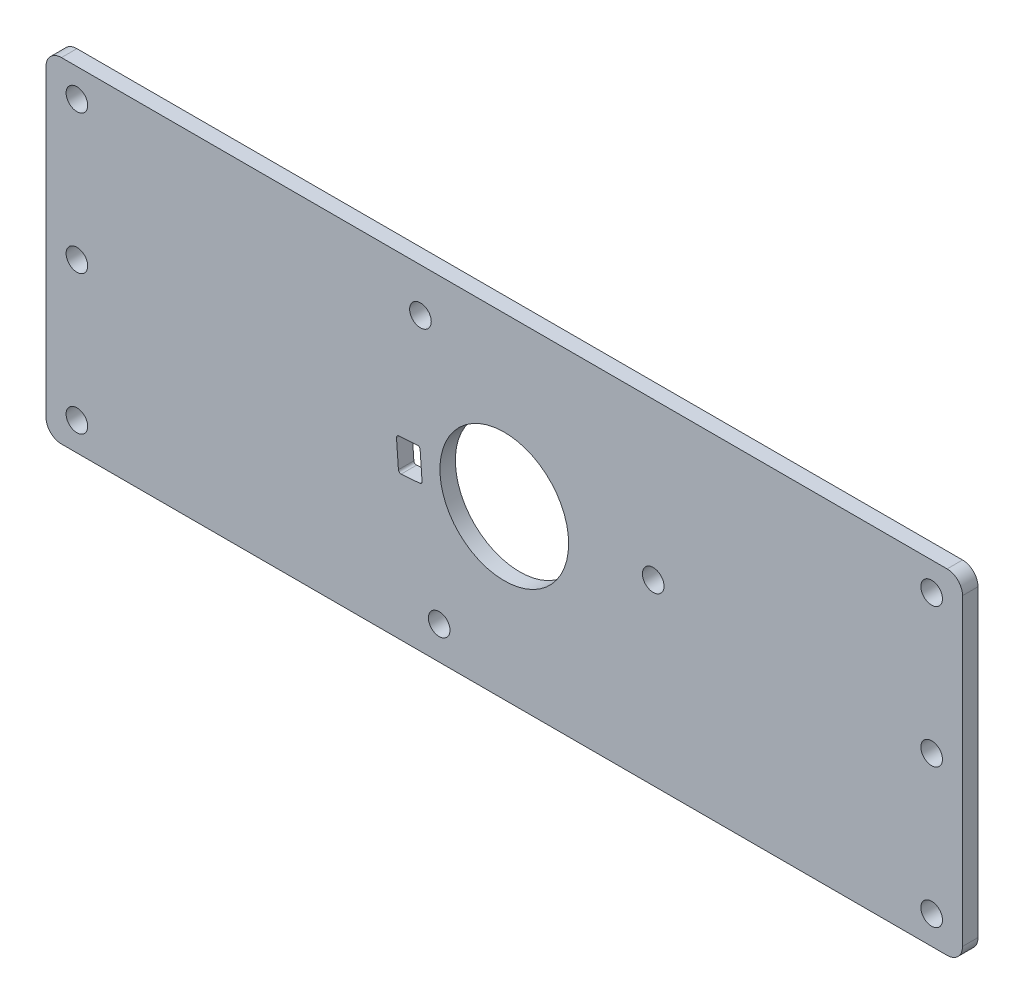
ISO-10303-21;
HEADER;
FILE_DESCRIPTION(('STEP AP214'),'2;1');
FILE_NAME('part.step','',(''),(''),'','','');
FILE_SCHEMA(('AUTOMOTIVE_DESIGN { 1 0 10303 214 1 1 1 1 }'));
ENDSEC;
DATA;
#1=APPLICATION_CONTEXT('core data for automotive mechanical design processes');
#2=APPLICATION_PROTOCOL_DEFINITION('international standard','automotive_design',2000,#1);
#3=PRODUCT_CONTEXT('',#1,'mechanical');
#4=PRODUCT('Part','Part','',(#3));
#5=PRODUCT_RELATED_PRODUCT_CATEGORY('part','',(#4));
#6=PRODUCT_DEFINITION_FORMATION('','',#4);
#7=PRODUCT_DEFINITION_CONTEXT('part definition',#1,'design');
#8=PRODUCT_DEFINITION('design','',#6,#7);
#9=PRODUCT_DEFINITION_SHAPE('','',#8);
#10=(LENGTH_UNIT() NAMED_UNIT(*) SI_UNIT(.MILLI.,.METRE.));
#11=(NAMED_UNIT(*) PLANE_ANGLE_UNIT() SI_UNIT($,.RADIAN.));
#12=(NAMED_UNIT(*) SI_UNIT($,.STERADIAN.) SOLID_ANGLE_UNIT());
#13=UNCERTAINTY_MEASURE_WITH_UNIT(LENGTH_MEASURE(1.E-05),#10,'distance_accuracy_value','');
#14=(GEOMETRIC_REPRESENTATION_CONTEXT(3) GLOBAL_UNCERTAINTY_ASSIGNED_CONTEXT((#13)) GLOBAL_UNIT_ASSIGNED_CONTEXT((#10,
#11,#12)) REPRESENTATION_CONTEXT('',''));
#15=CARTESIAN_POINT('',(0.,0.,0.));
#16=DIRECTION('',(0.,0.,1.));
#17=DIRECTION('',(1.,0.,0.));
#18=AXIS2_PLACEMENT_3D('',#15,#16,#17);
#19=CARTESIAN_POINT('',(0.,0.,3.));
#20=DIRECTION('',(0.,0.,1.));
#21=DIRECTION('',(1.,0.,0.));
#22=AXIS2_PLACEMENT_3D('',#19,#20,#21);
#23=PLANE('',#22);
#24=CARTESIAN_POINT('',(28.9238655784469,2.1,3.));
#25=DIRECTION('',(0.,0.,1.));
#26=DIRECTION('',(1.,0.,0.));
#27=AXIS2_PLACEMENT_3D('',#24,#25,#26);
#28=CIRCLE('',#27,2.1);
#29=CARTESIAN_POINT('',(31.0238655784469,2.1,3.));
#30=VERTEX_POINT('',#29);
#31=EDGE_CURVE('E202',#30,#30,#28,.T.);
#32=ORIENTED_EDGE('',*,*,#31,.F.);
#33=EDGE_LOOP('',(#32));
#34=FACE_BOUND('',#33,.T.);
#35=CARTESIAN_POINT('',(-12.6432794412773,-26.0988023665807,3.));
#36=DIRECTION('',(0.,0.,1.));
#37=DIRECTION('',(1.,0.,0.));
#38=AXIS2_PLACEMENT_3D('',#35,#36,#37);
#39=CIRCLE('',#38,2.1);
#40=CARTESIAN_POINT('',(-10.5432794412773,-26.0988023665807,3.));
#41=VERTEX_POINT('',#40);
#42=EDGE_CURVE('E187',#41,#41,#39,.T.);
#43=ORIENTED_EDGE('',*,*,#42,.F.);
#44=EDGE_LOOP('',(#43));
#45=FACE_BOUND('',#44,.T.);
#46=DIRECTION('',(-0.0724137931034011,0.997374675118823,0.));
#47=VECTOR('',#46,1.);
#48=CARTESIAN_POINT('',(-16.1574697369303,-1.17310344827549,3.));
#49=LINE('',#48,#47);
#50=CARTESIAN_POINT('',(-15.9691938748615,-3.76627760358424,3.));
#51=VERTEX_POINT('',#50);
#52=CARTESIAN_POINT('',(-16.3457455989996,1.42007070703972,3.));
#53=VERTEX_POINT('',#52);
#54=EDGE_CURVE('E51',#51,#53,#49,.T.);
#55=ORIENTED_EDGE('',*,*,#54,.F.);
#56=CARTESIAN_POINT('',(-16.4678812124213,-3.80248450013776,3.));
#57=DIRECTION('',(0.,0.,1.));
#58=DIRECTION('',(1.,0.,0.));
#59=AXIS2_PLACEMENT_3D('',#56,#57,#58);
#60=CIRCLE('',#59,0.500000000000536);
#61=CARTESIAN_POINT('',(-16.4316743158647,-4.30117183769736,3.));
#62=VERTEX_POINT('',#61);
#63=EDGE_CURVE('E182',#62,#51,#60,.T.);
#64=ORIENTED_EDGE('',*,*,#63,.F.);
#65=DIRECTION('',(0.997374675118823,0.0724137931034014,0.));
#66=VECTOR('',#65,1.);
#67=CARTESIAN_POINT('',(0.224482758620699,-3.09186149287048,3.));
#68=LINE('',#67,#66);
#69=CARTESIAN_POINT('',(-20.0222231462948,-4.56186149286977,3.));
#70=VERTEX_POINT('',#69);
#71=EDGE_CURVE('E179',#70,#62,#68,.T.);
#72=ORIENTED_EDGE('',*,*,#71,.F.);
#73=CARTESIAN_POINT('',(-20.0584300428407,-4.0631741553066,3.));
#74=DIRECTION('',(0.,0.,1.));
#75=DIRECTION('',(1.,0.,0.));
#76=AXIS2_PLACEMENT_3D('',#73,#74,#75);
#77=CIRCLE('',#76,0.500000000003335);
#78=CARTESIAN_POINT('',(-20.5571173804032,-4.09938105186226,3.));
#79=VERTEX_POINT('',#78);
#80=EDGE_CURVE('E176',#79,#70,#77,.T.);
#81=ORIENTED_EDGE('',*,*,#80,.F.);
#82=DIRECTION('',(0.0724137931034011,-0.997374675118823,0.));
#83=VECTOR('',#82,1.);
#84=CARTESIAN_POINT('',(-20.7453932424722,-1.50620689655079,3.));
#85=LINE('',#84,#83);
#86=CARTESIAN_POINT('',(-20.9336691045406,1.08696725875143,3.));
#87=VERTEX_POINT('',#86);
#88=EDGE_CURVE('E170',#87,#79,#85,.T.);
#89=ORIENTED_EDGE('',*,*,#88,.F.);
#90=CARTESIAN_POINT('',(-20.4349817669818,1.12317415531184,3.));
#91=DIRECTION('',(0.,0.,1.));
#92=DIRECTION('',(1.,0.,0.));
#93=AXIS2_PLACEMENT_3D('',#90,#91,#92);
#94=CIRCLE('',#93,0.500000000000024);
#95=CARTESIAN_POINT('',(-20.4711886635364,1.62186149287106,3.));
#96=VERTEX_POINT('',#95);
#97=EDGE_CURVE('E168',#96,#87,#94,.T.);
#98=ORIENTED_EDGE('',*,*,#97,.F.);
#99=DIRECTION('',(-0.997374675118823,-0.0724137931034015,0.));
#100=VECTOR('',#99,1.);
#101=CARTESIAN_POINT('',(-0.224482758620692,3.09186149287038,3.));
#102=LINE('',#101,#100);
#103=CARTESIAN_POINT('',(-16.8806398331086,1.88255114804332,3.));
#104=VERTEX_POINT('',#103);
#105=EDGE_CURVE('E152',#104,#96,#102,.T.);
#106=ORIENTED_EDGE('',*,*,#105,.F.);
#107=CARTESIAN_POINT('',(-16.8444329365582,1.38386381048475,3.));
#108=DIRECTION('',(0.,0.,1.));
#109=DIRECTION('',(1.,0.,0.));
#110=AXIS2_PLACEMENT_3D('',#107,#108,#109);
#111=CIRCLE('',#110,0.499999999999454);
#112=EDGE_CURVE('E161',#53,#104,#111,.T.);
#113=ORIENTED_EDGE('',*,*,#112,.F.);
#114=EDGE_LOOP('',(#55,#64,#72,#81,#89,#98,#106,#113));
#115=FACE_BOUND('',#114,.T.);
#116=CARTESIAN_POINT('',(83.,0.,3.));
#117=DIRECTION('',(0.,0.,1.));
#118=DIRECTION('',(1.,0.,0.));
#119=AXIS2_PLACEMENT_3D('',#116,#117,#118);
#120=CIRCLE('',#119,2.1);
#121=CARTESIAN_POINT('',(85.1,0.,3.));
#122=VERTEX_POINT('',#121);
#123=EDGE_CURVE('E201',#122,#122,#120,.F.);
#124=ORIENTED_EDGE('',*,*,#123,.T.);
#125=EDGE_LOOP('',(#124));
#126=FACE_BOUND('',#125,.T.);
#127=DIRECTION('',(0.,1.,0.));
#128=VECTOR('',#127,1.);
#129=CARTESIAN_POINT('',(89.,-32.5,3.));
#130=LINE('',#129,#128);
#131=CARTESIAN_POINT('',(89.,-29.5,3.));
#132=VERTEX_POINT('',#131);
#133=CARTESIAN_POINT('',(89.,29.5,3.));
#134=VERTEX_POINT('',#133);
#135=EDGE_CURVE('E230',#132,#134,#130,.T.);
#136=ORIENTED_EDGE('',*,*,#135,.T.);
#137=CARTESIAN_POINT('',(86.,29.5,3.));
#138=DIRECTION('',(0.,0.,1.));
#139=DIRECTION('',(1.,0.,0.));
#140=AXIS2_PLACEMENT_3D('',#137,#138,#139);
#141=CIRCLE('',#140,3.);
#142=CARTESIAN_POINT('',(86.,32.5,3.));
#143=VERTEX_POINT('',#142);
#144=EDGE_CURVE('E271',#134,#143,#141,.T.);
#145=ORIENTED_EDGE('',*,*,#144,.T.);
#146=DIRECTION('',(-1.,0.,0.));
#147=VECTOR('',#146,1.);
#148=CARTESIAN_POINT('',(89.,32.5,3.));
#149=LINE('',#148,#147);
#150=CARTESIAN_POINT('',(-86.,32.5,3.));
#151=VERTEX_POINT('',#150);
#152=EDGE_CURVE('E233',#143,#151,#149,.T.);
#153=ORIENTED_EDGE('',*,*,#152,.T.);
#154=CARTESIAN_POINT('',(-86.,29.5,3.));
#155=DIRECTION('',(0.,0.,1.));
#156=DIRECTION('',(1.,0.,0.));
#157=AXIS2_PLACEMENT_3D('',#154,#155,#156);
#158=CIRCLE('',#157,3.);
#159=CARTESIAN_POINT('',(-89.,29.5,3.));
#160=VERTEX_POINT('',#159);
#161=EDGE_CURVE('E265',#151,#160,#158,.T.);
#162=ORIENTED_EDGE('',*,*,#161,.T.);
#163=DIRECTION('',(0.,-1.,0.));
#164=VECTOR('',#163,1.);
#165=CARTESIAN_POINT('',(-89.,-32.5,3.));
#166=LINE('',#165,#164);
#167=CARTESIAN_POINT('',(-89.,-29.5,3.));
#168=VERTEX_POINT('',#167);
#169=EDGE_CURVE('E223',#160,#168,#166,.T.);
#170=ORIENTED_EDGE('',*,*,#169,.T.);
#171=CARTESIAN_POINT('',(-86.,-29.5,3.));
#172=DIRECTION('',(0.,0.,1.));
#173=DIRECTION('',(1.,0.,0.));
#174=AXIS2_PLACEMENT_3D('',#171,#172,#173);
#175=CIRCLE('',#174,3.);
#176=CARTESIAN_POINT('',(-86.,-32.5,3.));
#177=VERTEX_POINT('',#176);
#178=EDGE_CURVE('E267',#168,#177,#175,.T.);
#179=ORIENTED_EDGE('',*,*,#178,.T.);
#180=DIRECTION('',(1.,0.,0.));
#181=VECTOR('',#180,1.);
#182=CARTESIAN_POINT('',(89.,-32.5,3.));
#183=LINE('',#182,#181);
#184=CARTESIAN_POINT('',(86.,-32.5,3.));
#185=VERTEX_POINT('',#184);
#186=EDGE_CURVE('E226',#177,#185,#183,.T.);
#187=ORIENTED_EDGE('',*,*,#186,.T.);
#188=CARTESIAN_POINT('',(86.,-29.5,3.));
#189=DIRECTION('',(0.,0.,1.));
#190=DIRECTION('',(1.,0.,0.));
#191=AXIS2_PLACEMENT_3D('',#188,#189,#190);
#192=CIRCLE('',#191,3.);
#193=EDGE_CURVE('E269',#185,#132,#192,.T.);
#194=ORIENTED_EDGE('',*,*,#193,.T.);
#195=EDGE_LOOP('',(#136,#145,#153,#162,#170,#179,#187,#194));
#196=FACE_BOUND('',#195,.T.);
#197=CARTESIAN_POINT('',(-83.,27.,3.));
#198=DIRECTION('',(0.,0.,1.));
#199=DIRECTION('',(1.,0.,0.));
#200=AXIS2_PLACEMENT_3D('',#197,#198,#199);
#201=CIRCLE('',#200,2.1);
#202=CARTESIAN_POINT('',(-80.9,27.,3.));
#203=VERTEX_POINT('',#202);
#204=EDGE_CURVE('E211',#203,#203,#201,.T.);
#205=ORIENTED_EDGE('',*,*,#204,.F.);
#206=EDGE_LOOP('',(#205));
#207=FACE_BOUND('',#206,.T.);
#208=CARTESIAN_POINT('',(83.,-27.,3.));
#209=DIRECTION('',(0.,0.,1.));
#210=DIRECTION('',(1.,0.,0.));
#211=AXIS2_PLACEMENT_3D('',#208,#209,#210);
#212=CIRCLE('',#211,2.1);
#213=CARTESIAN_POINT('',(85.1,-27.,3.));
#214=VERTEX_POINT('',#213);
#215=EDGE_CURVE('E470',#214,#214,#212,.F.);
#216=ORIENTED_EDGE('',*,*,#215,.T.);
#217=EDGE_LOOP('',(#216));
#218=FACE_BOUND('',#217,.T.);
#219=CARTESIAN_POINT('',(-83.,0.,3.));
#220=DIRECTION('',(0.,0.,1.));
#221=DIRECTION('',(1.,0.,0.));
#222=AXIS2_PLACEMENT_3D('',#219,#220,#221);
#223=CIRCLE('',#222,2.1);
#224=CARTESIAN_POINT('',(-80.9,0.,3.));
#225=VERTEX_POINT('',#224);
#226=EDGE_CURVE('E208',#225,#225,#223,.T.);
#227=ORIENTED_EDGE('',*,*,#226,.F.);
#228=EDGE_LOOP('',(#227));
#229=FACE_BOUND('',#228,.T.);
#230=CARTESIAN_POINT('',(-83.,-27.,3.));
#231=DIRECTION('',(0.,0.,1.));
#232=DIRECTION('',(1.,0.,0.));
#233=AXIS2_PLACEMENT_3D('',#230,#231,#232);
#234=CIRCLE('',#233,2.1);
#235=CARTESIAN_POINT('',(-80.9,-27.,3.));
#236=VERTEX_POINT('',#235);
#237=EDGE_CURVE('E212',#236,#236,#234,.T.);
#238=ORIENTED_EDGE('',*,*,#237,.F.);
#239=EDGE_LOOP('',(#238));
#240=FACE_BOUND('',#239,.T.);
#241=CARTESIAN_POINT('',(0.,0.,3.));
#242=DIRECTION('',(0.,0.,1.));
#243=DIRECTION('',(1.,0.,0.));
#244=AXIS2_PLACEMENT_3D('',#241,#242,#243);
#245=CIRCLE('',#244,12.5);
#246=CARTESIAN_POINT('',(12.5,0.,3.));
#247=VERTEX_POINT('',#246);
#248=EDGE_CURVE('E215',#247,#247,#245,.T.);
#249=ORIENTED_EDGE('',*,*,#248,.F.);
#250=EDGE_LOOP('',(#249));
#251=FACE_BOUND('',#250,.T.);
#252=CARTESIAN_POINT('',(-16.2805861371696,23.9988023665807,3.));
#253=DIRECTION('',(0.,0.,1.));
#254=DIRECTION('',(1.,0.,0.));
#255=AXIS2_PLACEMENT_3D('',#252,#253,#254);
#256=CIRCLE('',#255,2.1);
#257=CARTESIAN_POINT('',(-14.1805861371696,23.9988023665807,3.));
#258=VERTEX_POINT('',#257);
#259=EDGE_CURVE('E205',#258,#258,#256,.T.);
#260=ORIENTED_EDGE('',*,*,#259,.F.);
#261=EDGE_LOOP('',(#260));
#262=FACE_BOUND('',#261,.T.);
#263=CARTESIAN_POINT('',(83.,27.,3.));
#264=DIRECTION('',(0.,0.,1.));
#265=DIRECTION('',(1.,0.,0.));
#266=AXIS2_PLACEMENT_3D('',#263,#264,#265);
#267=CIRCLE('',#266,2.1);
#268=CARTESIAN_POINT('',(85.1,27.,3.));
#269=VERTEX_POINT('',#268);
#270=EDGE_CURVE('E198',#269,#269,#267,.F.);
#271=ORIENTED_EDGE('',*,*,#270,.T.);
#272=EDGE_LOOP('',(#271));
#273=FACE_BOUND('',#272,.T.);
#274=ADVANCED_FACE('F34',(#34,#45,#115,#126,#196,#207,#218,#229,#240,#251,#262,#273),#23,.T.);
#275=CARTESIAN_POINT('',(0.,0.,0.));
#276=DIRECTION('',(0.,0.,1.));
#277=DIRECTION('',(1.,0.,0.));
#278=AXIS2_PLACEMENT_3D('',#275,#276,#277);
#279=PLANE('',#278);
#280=CARTESIAN_POINT('',(28.9238655784469,2.1,0.));
#281=DIRECTION('',(0.,0.,1.));
#282=DIRECTION('',(1.,0.,0.));
#283=AXIS2_PLACEMENT_3D('',#280,#281,#282);
#284=CIRCLE('',#283,2.1);
#285=CARTESIAN_POINT('',(31.0238655784469,2.1,0.));
#286=VERTEX_POINT('',#285);
#287=EDGE_CURVE('E38',#286,#286,#284,.T.);
#288=ORIENTED_EDGE('',*,*,#287,.T.);
#289=EDGE_LOOP('',(#288));
#290=FACE_BOUND('',#289,.T.);
#291=CARTESIAN_POINT('',(-12.6432794412773,-26.0988023665807,0.));
#292=DIRECTION('',(0.,0.,1.));
#293=DIRECTION('',(1.,0.,0.));
#294=AXIS2_PLACEMENT_3D('',#291,#292,#293);
#295=CIRCLE('',#294,2.1);
#296=CARTESIAN_POINT('',(-10.5432794412773,-26.0988023665807,0.));
#297=VERTEX_POINT('',#296);
#298=EDGE_CURVE('E307',#297,#297,#295,.T.);
#299=ORIENTED_EDGE('',*,*,#298,.T.);
#300=EDGE_LOOP('',(#299));
#301=FACE_BOUND('',#300,.T.);
#302=CARTESIAN_POINT('',(-16.4678812124213,-3.80248450013776,0.));
#303=DIRECTION('',(0.,0.,1.));
#304=DIRECTION('',(1.,0.,0.));
#305=AXIS2_PLACEMENT_3D('',#302,#303,#304);
#306=CIRCLE('',#305,0.500000000000536);
#307=CARTESIAN_POINT('',(-16.4316743158647,-4.30117183769736,0.));
#308=VERTEX_POINT('',#307);
#309=CARTESIAN_POINT('',(-15.9691938748615,-3.76627760358424,0.));
#310=VERTEX_POINT('',#309);
#311=EDGE_CURVE('E43',#308,#310,#306,.T.);
#312=ORIENTED_EDGE('',*,*,#311,.T.);
#313=DIRECTION('',(-0.0724137931034011,0.997374675118823,0.));
#314=VECTOR('',#313,1.);
#315=CARTESIAN_POINT('',(-16.1574697369303,-1.17310344827549,0.));
#316=LINE('',#315,#314);
#317=CARTESIAN_POINT('',(-16.3457455989996,1.42007070703972,0.));
#318=VERTEX_POINT('',#317);
#319=EDGE_CURVE('E11',#310,#318,#316,.T.);
#320=ORIENTED_EDGE('',*,*,#319,.T.);
#321=CARTESIAN_POINT('',(-16.8444329365582,1.38386381048475,0.));
#322=DIRECTION('',(0.,0.,1.));
#323=DIRECTION('',(1.,0.,0.));
#324=AXIS2_PLACEMENT_3D('',#321,#322,#323);
#325=CIRCLE('',#324,0.499999999999454);
#326=CARTESIAN_POINT('',(-16.8806398331086,1.88255114804371,0.));
#327=VERTEX_POINT('',#326);
#328=EDGE_CURVE('E283',#318,#327,#325,.T.);
#329=ORIENTED_EDGE('',*,*,#328,.T.);
#330=DIRECTION('',(-0.997374675118823,-0.0724137931034015,0.));
#331=VECTOR('',#330,1.);
#332=CARTESIAN_POINT('',(-0.224482758620692,3.09186149287038,0.));
#333=LINE('',#332,#331);
#334=CARTESIAN_POINT('',(-20.4711886635364,1.62186149287106,0.));
#335=VERTEX_POINT('',#334);
#336=EDGE_CURVE('E155',#327,#335,#333,.T.);
#337=ORIENTED_EDGE('',*,*,#336,.T.);
#338=CARTESIAN_POINT('',(-20.4349817669818,1.12317415531184,0.));
#339=DIRECTION('',(0.,0.,1.));
#340=DIRECTION('',(1.,0.,0.));
#341=AXIS2_PLACEMENT_3D('',#338,#339,#340);
#342=CIRCLE('',#341,0.500000000000024);
#343=CARTESIAN_POINT('',(-20.9336691045406,1.08696725875143,0.));
#344=VERTEX_POINT('',#343);
#345=EDGE_CURVE('E310',#335,#344,#342,.T.);
#346=ORIENTED_EDGE('',*,*,#345,.T.);
#347=DIRECTION('',(0.0724137931034011,-0.997374675118823,0.));
#348=VECTOR('',#347,1.);
#349=CARTESIAN_POINT('',(-20.7453932424722,-1.50620689655079,0.));
#350=LINE('',#349,#348);
#351=CARTESIAN_POINT('',(-20.5571173804032,-4.09938105186226,0.));
#352=VERTEX_POINT('',#351);
#353=EDGE_CURVE('E313',#344,#352,#350,.T.);
#354=ORIENTED_EDGE('',*,*,#353,.T.);
#355=CARTESIAN_POINT('',(-20.0584300428407,-4.0631741553066,0.));
#356=DIRECTION('',(0.,0.,1.));
#357=DIRECTION('',(1.,0.,0.));
#358=AXIS2_PLACEMENT_3D('',#355,#356,#357);
#359=CIRCLE('',#358,0.500000000003335);
#360=CARTESIAN_POINT('',(-20.0222231462948,-4.56186149286977,0.));
#361=VERTEX_POINT('',#360);
#362=EDGE_CURVE('E316',#352,#361,#359,.T.);
#363=ORIENTED_EDGE('',*,*,#362,.T.);
#364=DIRECTION('',(0.997374675118823,0.0724137931034014,0.));
#365=VECTOR('',#364,1.);
#366=CARTESIAN_POINT('',(0.224482758620699,-3.09186149287048,0.));
#367=LINE('',#366,#365);
#368=EDGE_CURVE('E319',#361,#308,#367,.T.);
#369=ORIENTED_EDGE('',*,*,#368,.T.);
#370=EDGE_LOOP('',(#312,#320,#329,#337,#346,#354,#363,#369));
#371=FACE_BOUND('',#370,.T.);
#372=CARTESIAN_POINT('',(-16.2805861371696,23.9988023665807,0.));
#373=DIRECTION('',(0.,0.,1.));
#374=DIRECTION('',(1.,0.,0.));
#375=AXIS2_PLACEMENT_3D('',#372,#373,#374);
#376=CIRCLE('',#375,2.1);
#377=CARTESIAN_POINT('',(-14.1805861371696,23.9988023665807,0.));
#378=VERTEX_POINT('',#377);
#379=EDGE_CURVE('E301',#378,#378,#376,.T.);
#380=ORIENTED_EDGE('',*,*,#379,.T.);
#381=EDGE_LOOP('',(#380));
#382=FACE_BOUND('',#381,.T.);
#383=CARTESIAN_POINT('',(0.,0.,0.));
#384=DIRECTION('',(0.,0.,1.));
#385=DIRECTION('',(1.,0.,0.));
#386=AXIS2_PLACEMENT_3D('',#383,#384,#385);
#387=CIRCLE('',#386,12.5);
#388=CARTESIAN_POINT('',(12.5,0.,0.));
#389=VERTEX_POINT('',#388);
#390=EDGE_CURVE('E298',#389,#389,#387,.T.);
#391=ORIENTED_EDGE('',*,*,#390,.T.);
#392=EDGE_LOOP('',(#391));
#393=FACE_BOUND('',#392,.T.);
#394=CARTESIAN_POINT('',(-83.,-27.,0.));
#395=DIRECTION('',(0.,0.,1.));
#396=DIRECTION('',(1.,0.,0.));
#397=AXIS2_PLACEMENT_3D('',#394,#395,#396);
#398=CIRCLE('',#397,2.1);
#399=CARTESIAN_POINT('',(-80.9,-27.,0.));
#400=VERTEX_POINT('',#399);
#401=EDGE_CURVE('E295',#400,#400,#398,.T.);
#402=ORIENTED_EDGE('',*,*,#401,.T.);
#403=EDGE_LOOP('',(#402));
#404=FACE_BOUND('',#403,.T.);
#405=CARTESIAN_POINT('',(-83.,0.,0.));
#406=DIRECTION('',(0.,0.,1.));
#407=DIRECTION('',(1.,0.,0.));
#408=AXIS2_PLACEMENT_3D('',#405,#406,#407);
#409=CIRCLE('',#408,2.1);
#410=CARTESIAN_POINT('',(-80.9,0.,0.));
#411=VERTEX_POINT('',#410);
#412=EDGE_CURVE('E292',#411,#411,#409,.T.);
#413=ORIENTED_EDGE('',*,*,#412,.T.);
#414=EDGE_LOOP('',(#413));
#415=FACE_BOUND('',#414,.T.);
#416=CARTESIAN_POINT('',(-83.,27.,0.));
#417=DIRECTION('',(0.,0.,1.));
#418=DIRECTION('',(1.,0.,0.));
#419=AXIS2_PLACEMENT_3D('',#416,#417,#418);
#420=CIRCLE('',#419,2.1);
#421=CARTESIAN_POINT('',(-80.9,27.,0.));
#422=VERTEX_POINT('',#421);
#423=EDGE_CURVE('E222',#422,#422,#420,.T.);
#424=ORIENTED_EDGE('',*,*,#423,.T.);
#425=EDGE_LOOP('',(#424));
#426=FACE_BOUND('',#425,.T.);
#427=DIRECTION('',(-1.,0.,0.));
#428=VECTOR('',#427,1.);
#429=CARTESIAN_POINT('',(89.,32.5,0.));
#430=LINE('',#429,#428);
#431=CARTESIAN_POINT('',(86.,32.5,0.));
#432=VERTEX_POINT('',#431);
#433=CARTESIAN_POINT('',(-86.,32.5,0.));
#434=VERTEX_POINT('',#433);
#435=EDGE_CURVE('E227',#432,#434,#430,.T.);
#436=ORIENTED_EDGE('',*,*,#435,.F.);
#437=CARTESIAN_POINT('',(86.,29.5,0.));
#438=DIRECTION('',(0.,0.,1.));
#439=DIRECTION('',(1.,0.,0.));
#440=AXIS2_PLACEMENT_3D('',#437,#438,#439);
#441=CIRCLE('',#440,3.);
#442=CARTESIAN_POINT('',(89.,29.5,0.));
#443=VERTEX_POINT('',#442);
#444=EDGE_CURVE('E258',#432,#443,#441,.F.);
#445=ORIENTED_EDGE('',*,*,#444,.T.);
#446=DIRECTION('',(0.,1.,0.));
#447=VECTOR('',#446,1.);
#448=CARTESIAN_POINT('',(89.,-32.5,0.));
#449=LINE('',#448,#447);
#450=CARTESIAN_POINT('',(89.,-29.5,0.));
#451=VERTEX_POINT('',#450);
#452=EDGE_CURVE('E243',#451,#443,#449,.T.);
#453=ORIENTED_EDGE('',*,*,#452,.F.);
#454=CARTESIAN_POINT('',(86.,-29.5,0.));
#455=DIRECTION('',(0.,0.,1.));
#456=DIRECTION('',(1.,0.,0.));
#457=AXIS2_PLACEMENT_3D('',#454,#455,#456);
#458=CIRCLE('',#457,3.);
#459=CARTESIAN_POINT('',(86.,-32.5,0.));
#460=VERTEX_POINT('',#459);
#461=EDGE_CURVE('E256',#451,#460,#458,.F.);
#462=ORIENTED_EDGE('',*,*,#461,.T.);
#463=DIRECTION('',(1.,0.,0.));
#464=VECTOR('',#463,1.);
#465=CARTESIAN_POINT('',(89.,-32.5,0.));
#466=LINE('',#465,#464);
#467=CARTESIAN_POINT('',(-86.,-32.5,0.));
#468=VERTEX_POINT('',#467);
#469=EDGE_CURVE('E240',#468,#460,#466,.T.);
#470=ORIENTED_EDGE('',*,*,#469,.F.);
#471=CARTESIAN_POINT('',(-86.,-29.5,0.));
#472=DIRECTION('',(0.,0.,1.));
#473=DIRECTION('',(1.,0.,0.));
#474=AXIS2_PLACEMENT_3D('',#471,#472,#473);
#475=CIRCLE('',#474,3.);
#476=CARTESIAN_POINT('',(-89.,-29.5,0.));
#477=VERTEX_POINT('',#476);
#478=EDGE_CURVE('E254',#468,#477,#475,.F.);
#479=ORIENTED_EDGE('',*,*,#478,.T.);
#480=DIRECTION('',(0.,-1.,0.));
#481=VECTOR('',#480,1.);
#482=CARTESIAN_POINT('',(-89.,-32.5,0.));
#483=LINE('',#482,#481);
#484=CARTESIAN_POINT('',(-89.,29.5,0.));
#485=VERTEX_POINT('',#484);
#486=EDGE_CURVE('E237',#485,#477,#483,.T.);
#487=ORIENTED_EDGE('',*,*,#486,.F.);
#488=CARTESIAN_POINT('',(-86.,29.5,0.));
#489=DIRECTION('',(0.,0.,1.));
#490=DIRECTION('',(1.,0.,0.));
#491=AXIS2_PLACEMENT_3D('',#488,#489,#490);
#492=CIRCLE('',#491,3.);
#493=EDGE_CURVE('E252',#485,#434,#492,.F.);
#494=ORIENTED_EDGE('',*,*,#493,.T.);
#495=EDGE_LOOP('',(#436,#445,#453,#462,#470,#479,#487,#494));
#496=FACE_BOUND('',#495,.T.);
#497=CARTESIAN_POINT('',(83.,-27.,0.));
#498=DIRECTION('',(0.,0.,1.));
#499=DIRECTION('',(1.,0.,0.));
#500=AXIS2_PLACEMENT_3D('',#497,#498,#499);
#501=CIRCLE('',#500,2.1);
#502=CARTESIAN_POINT('',(85.1,-27.,0.));
#503=VERTEX_POINT('',#502);
#504=EDGE_CURVE('E286',#503,#503,#501,.F.);
#505=ORIENTED_EDGE('',*,*,#504,.F.);
#506=EDGE_LOOP('',(#505));
#507=FACE_BOUND('',#506,.T.);
#508=CARTESIAN_POINT('',(83.,0.,0.));
#509=DIRECTION('',(0.,0.,1.));
#510=DIRECTION('',(1.,0.,0.));
#511=AXIS2_PLACEMENT_3D('',#508,#509,#510);
#512=CIRCLE('',#511,2.1);
#513=CARTESIAN_POINT('',(85.1,0.,0.));
#514=VERTEX_POINT('',#513);
#515=EDGE_CURVE('E289',#514,#514,#512,.F.);
#516=ORIENTED_EDGE('',*,*,#515,.F.);
#517=EDGE_LOOP('',(#516));
#518=FACE_BOUND('',#517,.T.);
#519=CARTESIAN_POINT('',(83.,27.,0.));
#520=DIRECTION('',(0.,0.,1.));
#521=DIRECTION('',(1.,0.,0.));
#522=AXIS2_PLACEMENT_3D('',#519,#520,#521);
#523=CIRCLE('',#522,2.1);
#524=CARTESIAN_POINT('',(85.1,27.,0.));
#525=VERTEX_POINT('',#524);
#526=EDGE_CURVE('E304',#525,#525,#523,.F.);
#527=ORIENTED_EDGE('',*,*,#526,.F.);
#528=EDGE_LOOP('',(#527));
#529=FACE_BOUND('',#528,.T.);
#530=ADVANCED_FACE('F329',(#290,#301,#371,#382,#393,#404,#415,#426,#496,#507,#518,#529),#279,.F.);
#531=CARTESIAN_POINT('',(-89.,-32.5,3.));
#532=DIRECTION('',(1.,0.,0.));
#533=DIRECTION('',(0.,0.,-1.));
#534=AXIS2_PLACEMENT_3D('',#531,#532,#533);
#535=PLANE('',#534);
#536=ORIENTED_EDGE('',*,*,#486,.T.);
#537=DIRECTION('',(0.,0.,-1.));
#538=VECTOR('',#537,1.);
#539=CARTESIAN_POINT('',(-89.,-29.5,3.));
#540=LINE('',#539,#538);
#541=EDGE_CURVE('E281',#477,#168,#540,.F.);
#542=ORIENTED_EDGE('',*,*,#541,.T.);
#543=ORIENTED_EDGE('',*,*,#169,.F.);
#544=DIRECTION('',(0.,0.,-1.));
#545=VECTOR('',#544,1.);
#546=CARTESIAN_POINT('',(-89.,29.5,3.));
#547=LINE('',#546,#545);
#548=EDGE_CURVE('E278',#160,#485,#547,.T.);
#549=ORIENTED_EDGE('',*,*,#548,.T.);
#550=EDGE_LOOP('',(#536,#542,#543,#549));
#551=FACE_BOUND('',#550,.T.);
#552=ADVANCED_FACE('F348',(#551),#535,.F.);
#553=CARTESIAN_POINT('',(89.,-32.5,3.));
#554=DIRECTION('',(0.,1.,0.));
#555=DIRECTION('',(-1.,0.,0.));
#556=AXIS2_PLACEMENT_3D('',#553,#554,#555);
#557=PLANE('',#556);
#558=ORIENTED_EDGE('',*,*,#469,.T.);
#559=DIRECTION('',(0.,0.,-1.));
#560=VECTOR('',#559,1.);
#561=CARTESIAN_POINT('',(86.,-32.5,3.));
#562=LINE('',#561,#560);
#563=EDGE_CURVE('E276',#460,#185,#562,.F.);
#564=ORIENTED_EDGE('',*,*,#563,.T.);
#565=ORIENTED_EDGE('',*,*,#186,.F.);
#566=DIRECTION('',(0.,0.,-1.));
#567=VECTOR('',#566,1.);
#568=CARTESIAN_POINT('',(-86.,-32.5,3.));
#569=LINE('',#568,#567);
#570=EDGE_CURVE('E273',#177,#468,#569,.T.);
#571=ORIENTED_EDGE('',*,*,#570,.T.);
#572=EDGE_LOOP('',(#558,#564,#565,#571));
#573=FACE_BOUND('',#572,.T.);
#574=ADVANCED_FACE('F364',(#573),#557,.F.);
#575=CARTESIAN_POINT('',(89.,-32.5,3.));
#576=DIRECTION('',(-1.,0.,0.));
#577=DIRECTION('',(0.,0.,1.));
#578=AXIS2_PLACEMENT_3D('',#575,#576,#577);
#579=PLANE('',#578);
#580=ORIENTED_EDGE('',*,*,#452,.T.);
#581=DIRECTION('',(0.,0.,-1.));
#582=VECTOR('',#581,1.);
#583=CARTESIAN_POINT('',(89.,29.5,3.));
#584=LINE('',#583,#582);
#585=EDGE_CURVE('E263',#443,#134,#584,.F.);
#586=ORIENTED_EDGE('',*,*,#585,.T.);
#587=ORIENTED_EDGE('',*,*,#135,.F.);
#588=DIRECTION('',(0.,0.,-1.));
#589=VECTOR('',#588,1.);
#590=CARTESIAN_POINT('',(89.,-29.5,3.));
#591=LINE('',#590,#589);
#592=EDGE_CURVE('E260',#132,#451,#591,.T.);
#593=ORIENTED_EDGE('',*,*,#592,.T.);
#594=EDGE_LOOP('',(#580,#586,#587,#593));
#595=FACE_BOUND('',#594,.T.);
#596=ADVANCED_FACE('F360',(#595),#579,.F.);
#597=CARTESIAN_POINT('',(89.,32.5,3.));
#598=DIRECTION('',(0.,-1.,0.));
#599=DIRECTION('',(1.,0.,0.));
#600=AXIS2_PLACEMENT_3D('',#597,#598,#599);
#601=PLANE('',#600);
#602=ORIENTED_EDGE('',*,*,#152,.F.);
#603=DIRECTION('',(0.,0.,-1.));
#604=VECTOR('',#603,1.);
#605=CARTESIAN_POINT('',(86.,32.5,3.));
#606=LINE('',#605,#604);
#607=EDGE_CURVE('E249',#143,#432,#606,.T.);
#608=ORIENTED_EDGE('',*,*,#607,.T.);
#609=ORIENTED_EDGE('',*,*,#435,.T.);
#610=DIRECTION('',(0.,0.,-1.));
#611=VECTOR('',#610,1.);
#612=CARTESIAN_POINT('',(-86.,32.5,3.));
#613=LINE('',#612,#611);
#614=EDGE_CURVE('E236',#434,#151,#613,.F.);
#615=ORIENTED_EDGE('',*,*,#614,.T.);
#616=EDGE_LOOP('',(#602,#608,#609,#615));
#617=FACE_BOUND('',#616,.T.);
#618=ADVANCED_FACE('F356',(#617),#601,.F.);
#619=CARTESIAN_POINT('',(86.,29.5,3.));
#620=DIRECTION('',(0.,0.,-1.));
#621=DIRECTION('',(-1.,0.,0.));
#622=AXIS2_PLACEMENT_3D('',#619,#620,#621);
#623=CYLINDRICAL_SURFACE('',#622,3.);
#624=ORIENTED_EDGE('',*,*,#144,.F.);
#625=ORIENTED_EDGE('',*,*,#585,.F.);
#626=ORIENTED_EDGE('',*,*,#444,.F.);
#627=ORIENTED_EDGE('',*,*,#607,.F.);
#628=EDGE_LOOP('',(#624,#625,#626,#627));
#629=FACE_BOUND('',#628,.T.);
#630=ADVANCED_FACE('F359',(#629),#623,.T.);
#631=CARTESIAN_POINT('',(86.,-29.5,3.));
#632=DIRECTION('',(0.,0.,-1.));
#633=DIRECTION('',(-1.,0.,0.));
#634=AXIS2_PLACEMENT_3D('',#631,#632,#633);
#635=CYLINDRICAL_SURFACE('',#634,3.);
#636=ORIENTED_EDGE('',*,*,#193,.F.);
#637=ORIENTED_EDGE('',*,*,#563,.F.);
#638=ORIENTED_EDGE('',*,*,#461,.F.);
#639=ORIENTED_EDGE('',*,*,#592,.F.);
#640=EDGE_LOOP('',(#636,#637,#638,#639));
#641=FACE_BOUND('',#640,.T.);
#642=ADVANCED_FACE('F374',(#641),#635,.T.);
#643=CARTESIAN_POINT('',(-86.,-29.5,3.));
#644=DIRECTION('',(0.,0.,-1.));
#645=DIRECTION('',(-1.,0.,0.));
#646=AXIS2_PLACEMENT_3D('',#643,#644,#645);
#647=CYLINDRICAL_SURFACE('',#646,3.);
#648=ORIENTED_EDGE('',*,*,#178,.F.);
#649=ORIENTED_EDGE('',*,*,#541,.F.);
#650=ORIENTED_EDGE('',*,*,#478,.F.);
#651=ORIENTED_EDGE('',*,*,#570,.F.);
#652=EDGE_LOOP('',(#648,#649,#650,#651));
#653=FACE_BOUND('',#652,.T.);
#654=ADVANCED_FACE('F377',(#653),#647,.T.);
#655=CARTESIAN_POINT('',(-86.,29.5,3.));
#656=DIRECTION('',(0.,0.,-1.));
#657=DIRECTION('',(-1.,0.,0.));
#658=AXIS2_PLACEMENT_3D('',#655,#656,#657);
#659=CYLINDRICAL_SURFACE('',#658,3.);
#660=ORIENTED_EDGE('',*,*,#161,.F.);
#661=ORIENTED_EDGE('',*,*,#614,.F.);
#662=ORIENTED_EDGE('',*,*,#493,.F.);
#663=ORIENTED_EDGE('',*,*,#548,.F.);
#664=EDGE_LOOP('',(#660,#661,#662,#663));
#665=FACE_BOUND('',#664,.T.);
#666=ADVANCED_FACE('F36',(#665),#659,.T.);
#667=CARTESIAN_POINT('',(-83.,27.,-7.));
#668=DIRECTION('',(0.,0.,1.));
#669=DIRECTION('',(1.,0.,0.));
#670=AXIS2_PLACEMENT_3D('',#667,#668,#669);
#671=CYLINDRICAL_SURFACE('',#670,2.1);
#672=ORIENTED_EDGE('',*,*,#204,.T.);
#673=EDGE_LOOP('',(#672));
#674=FACE_BOUND('',#673,.T.);
#675=ORIENTED_EDGE('',*,*,#423,.F.);
#676=EDGE_LOOP('',(#675));
#677=FACE_BOUND('',#676,.T.);
#678=ADVANCED_FACE('F353',(#674,#677),#671,.F.);
#679=CARTESIAN_POINT('',(83.,-27.,-7.));
#680=DIRECTION('',(0.,0.,1.));
#681=DIRECTION('',(1.,0.,0.));
#682=AXIS2_PLACEMENT_3D('',#679,#680,#681);
#683=CYLINDRICAL_SURFACE('',#682,2.1);
#684=ORIENTED_EDGE('',*,*,#215,.F.);
#685=EDGE_LOOP('',(#684));
#686=FACE_BOUND('',#685,.T.);
#687=ORIENTED_EDGE('',*,*,#504,.T.);
#688=EDGE_LOOP('',(#687));
#689=FACE_BOUND('',#688,.T.);
#690=ADVANCED_FACE('F453',(#686,#689),#683,.F.);
#691=CARTESIAN_POINT('',(83.,0.,-7.));
#692=DIRECTION('',(0.,0.,1.));
#693=DIRECTION('',(1.,0.,0.));
#694=AXIS2_PLACEMENT_3D('',#691,#692,#693);
#695=CYLINDRICAL_SURFACE('',#694,2.1);
#696=ORIENTED_EDGE('',*,*,#123,.F.);
#697=EDGE_LOOP('',(#696));
#698=FACE_BOUND('',#697,.T.);
#699=ORIENTED_EDGE('',*,*,#515,.T.);
#700=EDGE_LOOP('',(#699));
#701=FACE_BOUND('',#700,.T.);
#702=ADVANCED_FACE('F456',(#698,#701),#695,.F.);
#703=CARTESIAN_POINT('',(-83.,0.,-7.));
#704=DIRECTION('',(0.,0.,1.));
#705=DIRECTION('',(1.,0.,0.));
#706=AXIS2_PLACEMENT_3D('',#703,#704,#705);
#707=CYLINDRICAL_SURFACE('',#706,2.1);
#708=ORIENTED_EDGE('',*,*,#226,.T.);
#709=EDGE_LOOP('',(#708));
#710=FACE_BOUND('',#709,.T.);
#711=ORIENTED_EDGE('',*,*,#412,.F.);
#712=EDGE_LOOP('',(#711));
#713=FACE_BOUND('',#712,.T.);
#714=ADVANCED_FACE('F459',(#710,#713),#707,.F.);
#715=CARTESIAN_POINT('',(-83.,-27.,-7.));
#716=DIRECTION('',(0.,0.,1.));
#717=DIRECTION('',(1.,0.,0.));
#718=AXIS2_PLACEMENT_3D('',#715,#716,#717);
#719=CYLINDRICAL_SURFACE('',#718,2.1);
#720=ORIENTED_EDGE('',*,*,#237,.T.);
#721=EDGE_LOOP('',(#720));
#722=FACE_BOUND('',#721,.T.);
#723=ORIENTED_EDGE('',*,*,#401,.F.);
#724=EDGE_LOOP('',(#723));
#725=FACE_BOUND('',#724,.T.);
#726=ADVANCED_FACE('F464',(#722,#725),#719,.F.);
#727=CARTESIAN_POINT('',(0.,0.,-7.));
#728=DIRECTION('',(0.,0.,1.));
#729=DIRECTION('',(1.,0.,0.));
#730=AXIS2_PLACEMENT_3D('',#727,#728,#729);
#731=CYLINDRICAL_SURFACE('',#730,12.5);
#732=ORIENTED_EDGE('',*,*,#248,.T.);
#733=EDGE_LOOP('',(#732));
#734=FACE_BOUND('',#733,.T.);
#735=ORIENTED_EDGE('',*,*,#390,.F.);
#736=EDGE_LOOP('',(#735));
#737=FACE_BOUND('',#736,.T.);
#738=ADVANCED_FACE('F426',(#734,#737),#731,.F.);
#739=CARTESIAN_POINT('',(-16.2805861371696,23.9988023665807,-7.));
#740=DIRECTION('',(0.,0.,1.));
#741=DIRECTION('',(1.,0.,0.));
#742=AXIS2_PLACEMENT_3D('',#739,#740,#741);
#743=CYLINDRICAL_SURFACE('',#742,2.1);
#744=ORIENTED_EDGE('',*,*,#259,.T.);
#745=EDGE_LOOP('',(#744));
#746=FACE_BOUND('',#745,.T.);
#747=ORIENTED_EDGE('',*,*,#379,.F.);
#748=EDGE_LOOP('',(#747));
#749=FACE_BOUND('',#748,.T.);
#750=ADVANCED_FACE('F418',(#746,#749),#743,.F.);
#751=CARTESIAN_POINT('',(83.,27.,-7.));
#752=DIRECTION('',(0.,0.,1.));
#753=DIRECTION('',(1.,0.,0.));
#754=AXIS2_PLACEMENT_3D('',#751,#752,#753);
#755=CYLINDRICAL_SURFACE('',#754,2.1);
#756=ORIENTED_EDGE('',*,*,#270,.F.);
#757=EDGE_LOOP('',(#756));
#758=FACE_BOUND('',#757,.T.);
#759=ORIENTED_EDGE('',*,*,#526,.T.);
#760=EDGE_LOOP('',(#759));
#761=FACE_BOUND('',#760,.T.);
#762=ADVANCED_FACE('F415',(#758,#761),#755,.F.);
#763=CARTESIAN_POINT('',(-16.1574697369303,-1.17310344827549,-7.));
#764=DIRECTION('',(0.997374675118823,0.0724137931034011,0.));
#765=DIRECTION('',(-0.0724137931034011,0.997374675118823,0.));
#766=AXIS2_PLACEMENT_3D('',#763,#764,#765);
#767=PLANE('',#766);
#768=DIRECTION('',(0.,0.,1.));
#769=VECTOR('',#768,1.);
#770=CARTESIAN_POINT('',(-15.9691938748615,-3.76627760358424,-7.));
#771=LINE('',#770,#769);
#772=EDGE_CURVE('E185',#310,#51,#771,.T.);
#773=ORIENTED_EDGE('',*,*,#772,.T.);
#774=ORIENTED_EDGE('',*,*,#54,.T.);
#775=DIRECTION('',(0.,0.,1.));
#776=VECTOR('',#775,1.);
#777=CARTESIAN_POINT('',(-16.3457455989996,1.42007070703972,-7.));
#778=LINE('',#777,#776);
#779=EDGE_CURVE('E158',#318,#53,#778,.T.);
#780=ORIENTED_EDGE('',*,*,#779,.F.);
#781=ORIENTED_EDGE('',*,*,#319,.F.);
#782=EDGE_LOOP('',(#773,#774,#780,#781));
#783=FACE_BOUND('',#782,.T.);
#784=ADVANCED_FACE('F417',(#783),#767,.F.);
#785=CARTESIAN_POINT('',(-16.4678812124213,-3.80248450013776,-7.));
#786=DIRECTION('',(0.,0.,1.));
#787=DIRECTION('',(1.,0.,0.));
#788=AXIS2_PLACEMENT_3D('',#785,#786,#787);
#789=CYLINDRICAL_SURFACE('',#788,0.500000000000536);
#790=DIRECTION('',(0.,0.,1.));
#791=VECTOR('',#790,1.);
#792=CARTESIAN_POINT('',(-16.4316743158647,-4.30117183769736,-7.));
#793=LINE('',#792,#791);
#794=EDGE_CURVE('E188',#308,#62,#793,.T.);
#795=ORIENTED_EDGE('',*,*,#794,.T.);
#796=ORIENTED_EDGE('',*,*,#63,.T.);
#797=ORIENTED_EDGE('',*,*,#772,.F.);
#798=ORIENTED_EDGE('',*,*,#311,.F.);
#799=EDGE_LOOP('',(#795,#796,#797,#798));
#800=FACE_BOUND('',#799,.T.);
#801=ADVANCED_FACE('F424',(#800),#789,.F.);
#802=CARTESIAN_POINT('',(0.224482758620699,-3.09186149287048,-7.));
#803=DIRECTION('',(0.0724137931034014,-0.997374675118823,0.));
#804=DIRECTION('',(0.997374675118823,0.0724137931034014,0.));
#805=AXIS2_PLACEMENT_3D('',#802,#803,#804);
#806=PLANE('',#805);
#807=DIRECTION('',(0.,0.,1.));
#808=VECTOR('',#807,1.);
#809=CARTESIAN_POINT('',(-20.0222231462948,-4.56186149286977,-7.));
#810=LINE('',#809,#808);
#811=EDGE_CURVE('E190',#361,#70,#810,.T.);
#812=ORIENTED_EDGE('',*,*,#811,.T.);
#813=ORIENTED_EDGE('',*,*,#71,.T.);
#814=ORIENTED_EDGE('',*,*,#794,.F.);
#815=ORIENTED_EDGE('',*,*,#368,.F.);
#816=EDGE_LOOP('',(#812,#813,#814,#815));
#817=FACE_BOUND('',#816,.T.);
#818=ADVANCED_FACE('F445',(#817),#806,.F.);
#819=CARTESIAN_POINT('',(-20.0584300428407,-4.0631741553066,-7.));
#820=DIRECTION('',(0.,0.,1.));
#821=DIRECTION('',(1.,0.,0.));
#822=AXIS2_PLACEMENT_3D('',#819,#820,#821);
#823=CYLINDRICAL_SURFACE('',#822,0.500000000003335);
#824=DIRECTION('',(0.,0.,1.));
#825=VECTOR('',#824,1.);
#826=CARTESIAN_POINT('',(-20.5571173804032,-4.09938105186226,-7.));
#827=LINE('',#826,#825);
#828=EDGE_CURVE('E192',#352,#79,#827,.T.);
#829=ORIENTED_EDGE('',*,*,#828,.T.);
#830=ORIENTED_EDGE('',*,*,#80,.T.);
#831=ORIENTED_EDGE('',*,*,#811,.F.);
#832=ORIENTED_EDGE('',*,*,#362,.F.);
#833=EDGE_LOOP('',(#829,#830,#831,#832));
#834=FACE_BOUND('',#833,.T.);
#835=ADVANCED_FACE('F441',(#834),#823,.F.);
#836=CARTESIAN_POINT('',(-20.7453932424722,-1.50620689655079,-7.));
#837=DIRECTION('',(-0.997374675118823,-0.0724137931034011,0.));
#838=DIRECTION('',(0.0724137931034011,-0.997374675118823,0.));
#839=AXIS2_PLACEMENT_3D('',#836,#837,#838);
#840=PLANE('',#839);
#841=DIRECTION('',(0.,0.,1.));
#842=VECTOR('',#841,1.);
#843=CARTESIAN_POINT('',(-20.9336691045406,1.08696725875143,-7.));
#844=LINE('',#843,#842);
#845=EDGE_CURVE('E194',#344,#87,#844,.T.);
#846=ORIENTED_EDGE('',*,*,#845,.T.);
#847=ORIENTED_EDGE('',*,*,#88,.T.);
#848=ORIENTED_EDGE('',*,*,#828,.F.);
#849=ORIENTED_EDGE('',*,*,#353,.F.);
#850=EDGE_LOOP('',(#846,#847,#848,#849));
#851=FACE_BOUND('',#850,.T.);
#852=ADVANCED_FACE('F437',(#851),#840,.F.);
#853=CARTESIAN_POINT('',(-20.4349817669818,1.12317415531184,-7.));
#854=DIRECTION('',(0.,0.,1.));
#855=DIRECTION('',(1.,0.,0.));
#856=AXIS2_PLACEMENT_3D('',#853,#854,#855);
#857=CYLINDRICAL_SURFACE('',#856,0.500000000000024);
#858=DIRECTION('',(0.,0.,1.));
#859=VECTOR('',#858,1.);
#860=CARTESIAN_POINT('',(-20.4711886635364,1.62186149287106,-7.));
#861=LINE('',#860,#859);
#862=EDGE_CURVE('E157',#335,#96,#861,.T.);
#863=ORIENTED_EDGE('',*,*,#862,.T.);
#864=ORIENTED_EDGE('',*,*,#97,.T.);
#865=ORIENTED_EDGE('',*,*,#845,.F.);
#866=ORIENTED_EDGE('',*,*,#345,.F.);
#867=EDGE_LOOP('',(#863,#864,#865,#866));
#868=FACE_BOUND('',#867,.T.);
#869=ADVANCED_FACE('F434',(#868),#857,.F.);
#870=CARTESIAN_POINT('',(-0.224482758620692,3.09186149287038,-7.));
#871=DIRECTION('',(-0.0724137931034015,0.997374675118823,0.));
#872=DIRECTION('',(-0.997374675118823,-0.0724137931034015,0.));
#873=AXIS2_PLACEMENT_3D('',#870,#871,#872);
#874=PLANE('',#873);
#875=DIRECTION('',(0.,0.,1.));
#876=VECTOR('',#875,1.);
#877=CARTESIAN_POINT('',(-16.8806398331086,1.88255114804332,-7.));
#878=LINE('',#877,#876);
#879=EDGE_CURVE('E59',#327,#104,#878,.T.);
#880=ORIENTED_EDGE('',*,*,#879,.T.);
#881=ORIENTED_EDGE('',*,*,#105,.T.);
#882=ORIENTED_EDGE('',*,*,#862,.F.);
#883=ORIENTED_EDGE('',*,*,#336,.F.);
#884=EDGE_LOOP('',(#880,#881,#882,#883));
#885=FACE_BOUND('',#884,.T.);
#886=ADVANCED_FACE('F149',(#885),#874,.F.);
#887=CARTESIAN_POINT('',(-16.8444329365582,1.38386381048475,-7.));
#888=DIRECTION('',(0.,0.,1.));
#889=DIRECTION('',(1.,0.,0.));
#890=AXIS2_PLACEMENT_3D('',#887,#888,#889);
#891=CYLINDRICAL_SURFACE('',#890,0.499999999999454);
#892=ORIENTED_EDGE('',*,*,#779,.T.);
#893=ORIENTED_EDGE('',*,*,#112,.T.);
#894=ORIENTED_EDGE('',*,*,#879,.F.);
#895=ORIENTED_EDGE('',*,*,#328,.F.);
#896=EDGE_LOOP('',(#892,#893,#894,#895));
#897=FACE_BOUND('',#896,.T.);
#898=ADVANCED_FACE('F162',(#897),#891,.F.);
#899=CARTESIAN_POINT('',(-12.6432794412773,-26.0988023665807,-7.));
#900=DIRECTION('',(0.,0.,1.));
#901=DIRECTION('',(1.,0.,0.));
#902=AXIS2_PLACEMENT_3D('',#899,#900,#901);
#903=CYLINDRICAL_SURFACE('',#902,2.1);
#904=ORIENTED_EDGE('',*,*,#42,.T.);
#905=EDGE_LOOP('',(#904));
#906=FACE_BOUND('',#905,.T.);
#907=ORIENTED_EDGE('',*,*,#298,.F.);
#908=EDGE_LOOP('',(#907));
#909=FACE_BOUND('',#908,.T.);
#910=ADVANCED_FACE('F333',(#906,#909),#903,.F.);
#911=CARTESIAN_POINT('',(28.9238655784469,2.1,-7.));
#912=DIRECTION('',(0.,0.,1.));
#913=DIRECTION('',(1.,0.,0.));
#914=AXIS2_PLACEMENT_3D('',#911,#912,#913);
#915=CYLINDRICAL_SURFACE('',#914,2.1);
#916=ORIENTED_EDGE('',*,*,#31,.T.);
#917=EDGE_LOOP('',(#916));
#918=FACE_BOUND('',#917,.T.);
#919=ORIENTED_EDGE('',*,*,#287,.F.);
#920=EDGE_LOOP('',(#919));
#921=FACE_BOUND('',#920,.T.);
#922=ADVANCED_FACE('F331',(#918,#921),#915,.F.);
#923=CLOSED_SHELL('',(#274,#530,#552,#574,#596,#618,#630,#642,#654,#666,#678,#690,#702,#714,
#726,#738,#750,#762,#784,#801,#818,#835,#852,#869,#886,#898,#910,#922));
#924=MANIFOLD_SOLID_BREP('B2',#923);
#925=ADVANCED_BREP_SHAPE_REPRESENTATION('',(#18,#924),#14);
#926=SHAPE_DEFINITION_REPRESENTATION(#9,#925);
ENDSEC;
END-ISO-10303-21;
